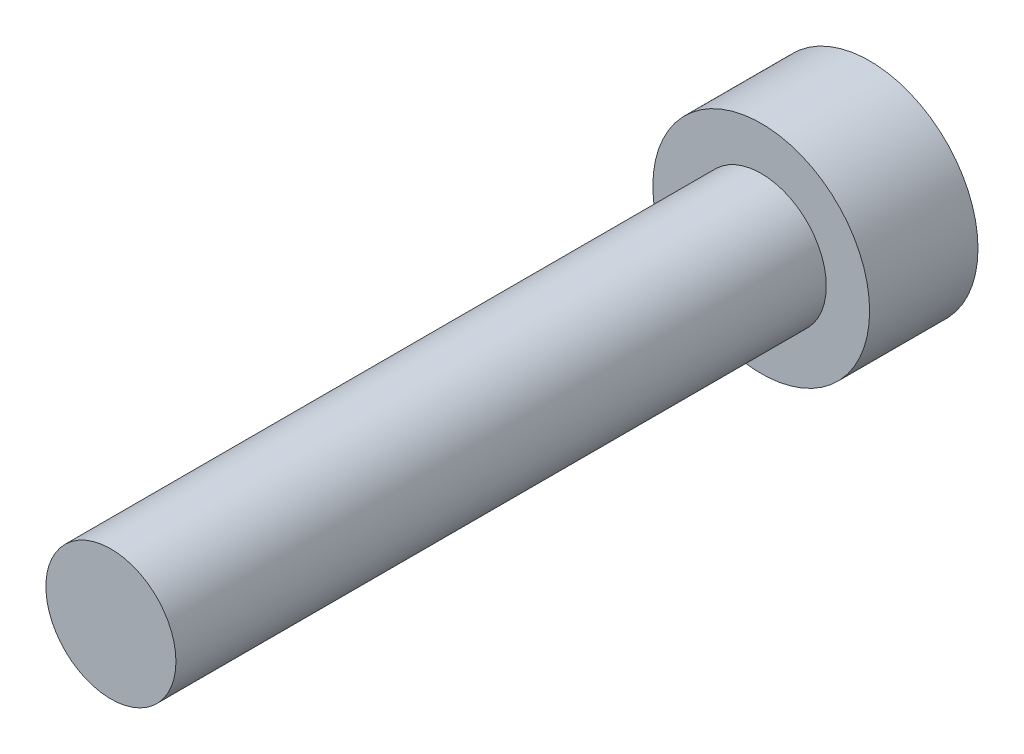
ISO-10303-21;
HEADER;
FILE_DESCRIPTION(('STEP AP214'),'2;1');
FILE_NAME('part.step','',(''),(''),'','','');
FILE_SCHEMA(('AUTOMOTIVE_DESIGN { 1 0 10303 214 1 1 1 1 }'));
ENDSEC;
DATA;
#1=APPLICATION_CONTEXT('core data for automotive mechanical design processes');
#2=APPLICATION_PROTOCOL_DEFINITION('international standard','automotive_design',2000,#1);
#3=PRODUCT_CONTEXT('',#1,'mechanical');
#4=PRODUCT('Part','Part','',(#3));
#5=PRODUCT_RELATED_PRODUCT_CATEGORY('part','',(#4));
#6=PRODUCT_DEFINITION_FORMATION('','',#4);
#7=PRODUCT_DEFINITION_CONTEXT('part definition',#1,'design');
#8=PRODUCT_DEFINITION('design','',#6,#7);
#9=PRODUCT_DEFINITION_SHAPE('','',#8);
#10=(LENGTH_UNIT() NAMED_UNIT(*) SI_UNIT(.MILLI.,.METRE.));
#11=(NAMED_UNIT(*) PLANE_ANGLE_UNIT() SI_UNIT($,.RADIAN.));
#12=(NAMED_UNIT(*) SI_UNIT($,.STERADIAN.) SOLID_ANGLE_UNIT());
#13=UNCERTAINTY_MEASURE_WITH_UNIT(LENGTH_MEASURE(1.E-05),#10,'distance_accuracy_value','');
#14=(GEOMETRIC_REPRESENTATION_CONTEXT(3) GLOBAL_UNCERTAINTY_ASSIGNED_CONTEXT((#13)) GLOBAL_UNIT_ASSIGNED_CONTEXT((#10,
#11,#12)) REPRESENTATION_CONTEXT('',''));
#15=CARTESIAN_POINT('',(0.,0.,0.));
#16=DIRECTION('',(0.,0.,1.));
#17=DIRECTION('',(1.,0.,0.));
#18=AXIS2_PLACEMENT_3D('',#15,#16,#17);
#19=CARTESIAN_POINT('',(0.,0.,0.));
#20=DIRECTION('',(0.,0.,1.));
#21=DIRECTION('',(1.,0.,0.));
#22=AXIS2_PLACEMENT_3D('',#19,#20,#21);
#23=PLANE('',#22);
#24=CARTESIAN_POINT('',(0.,0.,0.));
#25=DIRECTION('',(0.,0.,1.));
#26=DIRECTION('',(1.,0.,0.));
#27=AXIS2_PLACEMENT_3D('',#24,#25,#26);
#28=CIRCLE('',#27,2.5);
#29=CARTESIAN_POINT('',(2.5,0.,0.));
#30=VERTEX_POINT('',#29);
#31=EDGE_CURVE('E39',#30,#30,#28,.T.);
#32=ORIENTED_EDGE('',*,*,#31,.T.);
#33=EDGE_LOOP('',(#32));
#34=FACE_BOUND('',#33,.T.);
#35=CARTESIAN_POINT('',(0.,0.,0.));
#36=DIRECTION('',(0.,0.,1.));
#37=DIRECTION('',(1.,0.,0.));
#38=AXIS2_PLACEMENT_3D('',#35,#36,#37);
#39=CIRCLE('',#38,1.5);
#40=CARTESIAN_POINT('',(1.5,0.,0.));
#41=VERTEX_POINT('',#40);
#42=EDGE_CURVE('E48',#41,#41,#39,.T.);
#43=ORIENTED_EDGE('',*,*,#42,.F.);
#44=EDGE_LOOP('',(#43));
#45=FACE_BOUND('',#44,.T.);
#46=ADVANCED_FACE('F35',(#34,#45),#23,.T.);
#47=CARTESIAN_POINT('',(0.,0.,-2.5));
#48=DIRECTION('',(0.,0.,1.));
#49=DIRECTION('',(1.,0.,0.));
#50=AXIS2_PLACEMENT_3D('',#47,#48,#49);
#51=CYLINDRICAL_SURFACE('',#50,2.5);
#52=CARTESIAN_POINT('',(0.,0.,-2.5));
#53=DIRECTION('',(0.,0.,1.));
#54=DIRECTION('',(1.,0.,0.));
#55=AXIS2_PLACEMENT_3D('',#52,#53,#54);
#56=CIRCLE('',#55,2.5);
#57=CARTESIAN_POINT('',(2.5,0.,-2.5));
#58=VERTEX_POINT('',#57);
#59=EDGE_CURVE('E10',#58,#58,#56,.T.);
#60=ORIENTED_EDGE('',*,*,#59,.T.);
#61=EDGE_LOOP('',(#60));
#62=FACE_BOUND('',#61,.T.);
#63=ORIENTED_EDGE('',*,*,#31,.F.);
#64=EDGE_LOOP('',(#63));
#65=FACE_BOUND('',#64,.T.);
#66=ADVANCED_FACE('F37',(#62,#65),#51,.T.);
#67=CARTESIAN_POINT('',(0.,0.,-2.5));
#68=DIRECTION('',(0.,0.,1.));
#69=DIRECTION('',(1.,0.,0.));
#70=AXIS2_PLACEMENT_3D('',#67,#68,#69);
#71=PLANE('',#70);
#72=ORIENTED_EDGE('',*,*,#59,.F.);
#73=EDGE_LOOP('',(#72));
#74=FACE_BOUND('',#73,.T.);
#75=ADVANCED_FACE('F59',(#74),#71,.F.);
#76=CARTESIAN_POINT('',(0.,0.,15.));
#77=DIRECTION('',(0.,0.,-1.));
#78=DIRECTION('',(-1.,0.,0.));
#79=AXIS2_PLACEMENT_3D('',#76,#77,#78);
#80=CYLINDRICAL_SURFACE('',#79,1.5);
#81=CARTESIAN_POINT('',(0.,0.,15.));
#82=DIRECTION('',(0.,0.,1.));
#83=DIRECTION('',(1.,0.,0.));
#84=AXIS2_PLACEMENT_3D('',#81,#82,#83);
#85=CIRCLE('',#84,1.5);
#86=CARTESIAN_POINT('',(1.5,0.,15.));
#87=VERTEX_POINT('',#86);
#88=EDGE_CURVE('E46',#87,#87,#85,.T.);
#89=ORIENTED_EDGE('',*,*,#88,.F.);
#90=EDGE_LOOP('',(#89));
#91=FACE_BOUND('',#90,.T.);
#92=ORIENTED_EDGE('',*,*,#42,.T.);
#93=EDGE_LOOP('',(#92));
#94=FACE_BOUND('',#93,.T.);
#95=ADVANCED_FACE('F56',(#91,#94),#80,.T.);
#96=CARTESIAN_POINT('',(0.,0.,15.));
#97=DIRECTION('',(0.,0.,1.));
#98=DIRECTION('',(1.,0.,0.));
#99=AXIS2_PLACEMENT_3D('',#96,#97,#98);
#100=PLANE('',#99);
#101=ORIENTED_EDGE('',*,*,#88,.T.);
#102=EDGE_LOOP('',(#101));
#103=FACE_BOUND('',#102,.T.);
#104=ADVANCED_FACE('F54',(#103),#100,.T.);
#105=CLOSED_SHELL('',(#46,#66,#75,#95,#104));
#106=MANIFOLD_SOLID_BREP('B2',#105);
#107=ADVANCED_BREP_SHAPE_REPRESENTATION('',(#18,#106),#14);
#108=SHAPE_DEFINITION_REPRESENTATION(#9,#107);
ENDSEC;
END-ISO-10303-21;
